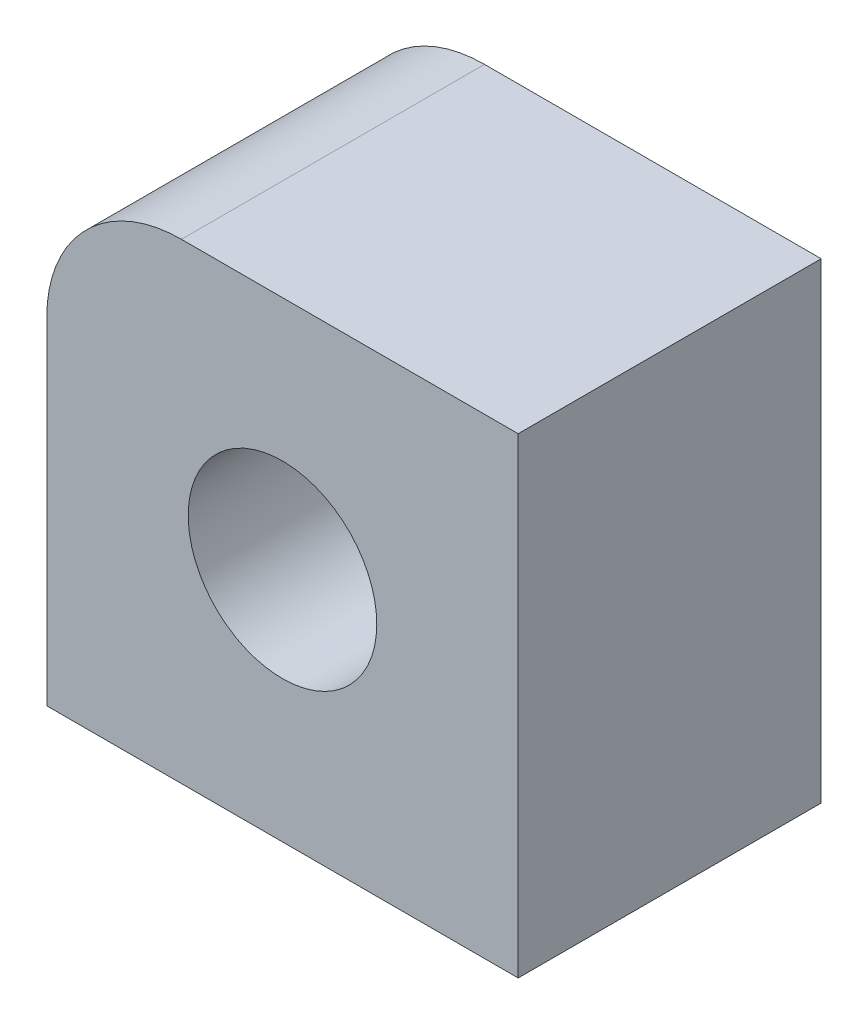
ISO-10303-21;
HEADER;
FILE_DESCRIPTION(('STEP AP214'),'2;1');
FILE_NAME('part.step','',(''),(''),'','','');
FILE_SCHEMA(('AUTOMOTIVE_DESIGN { 1 0 10303 214 1 1 1 1 }'));
ENDSEC;
DATA;
#1=APPLICATION_CONTEXT('core data for automotive mechanical design processes');
#2=APPLICATION_PROTOCOL_DEFINITION('international standard','automotive_design',2000,#1);
#3=PRODUCT_CONTEXT('',#1,'mechanical');
#4=PRODUCT('Part','Part','',(#3));
#5=PRODUCT_RELATED_PRODUCT_CATEGORY('part','',(#4));
#6=PRODUCT_DEFINITION_FORMATION('','',#4);
#7=PRODUCT_DEFINITION_CONTEXT('part definition',#1,'design');
#8=PRODUCT_DEFINITION('design','',#6,#7);
#9=PRODUCT_DEFINITION_SHAPE('','',#8);
#10=(LENGTH_UNIT() NAMED_UNIT(*) SI_UNIT(.MILLI.,.METRE.));
#11=(NAMED_UNIT(*) PLANE_ANGLE_UNIT() SI_UNIT($,.RADIAN.));
#12=(NAMED_UNIT(*) SI_UNIT($,.STERADIAN.) SOLID_ANGLE_UNIT());
#13=UNCERTAINTY_MEASURE_WITH_UNIT(LENGTH_MEASURE(1.E-05),#10,'distance_accuracy_value','');
#14=(GEOMETRIC_REPRESENTATION_CONTEXT(3) GLOBAL_UNCERTAINTY_ASSIGNED_CONTEXT((#13)) GLOBAL_UNIT_ASSIGNED_CONTEXT((#10,
#11,#12)) REPRESENTATION_CONTEXT('',''));
#15=CARTESIAN_POINT('',(0.,0.,0.));
#16=DIRECTION('',(0.,0.,1.));
#17=DIRECTION('',(1.,0.,0.));
#18=AXIS2_PLACEMENT_3D('',#15,#16,#17);
#19=CARTESIAN_POINT('',(-3.5,-3.5,4.5));
#20=DIRECTION('',(1.,0.,0.));
#21=DIRECTION('',(0.,0.,-1.));
#22=AXIS2_PLACEMENT_3D('',#19,#20,#21);
#23=PLANE('',#22);
#24=DIRECTION('',(0.,-1.,0.));
#25=VECTOR('',#24,1.);
#26=CARTESIAN_POINT('',(-3.5,-3.5,4.5));
#27=LINE('',#26,#25);
#28=CARTESIAN_POINT('',(-3.5,1.5,4.5));
#29=VERTEX_POINT('',#28);
#30=CARTESIAN_POINT('',(-3.5,-3.5,4.5));
#31=VERTEX_POINT('',#30);
#32=EDGE_CURVE('E79',#29,#31,#27,.T.);
#33=ORIENTED_EDGE('',*,*,#32,.F.);
#34=DIRECTION('',(0.,0.,-1.));
#35=VECTOR('',#34,1.);
#36=CARTESIAN_POINT('',(-3.5,1.5,4.5));
#37=LINE('',#36,#35);
#38=CARTESIAN_POINT('',(-3.5,1.5,0.));
#39=VERTEX_POINT('',#38);
#40=EDGE_CURVE('E102',#29,#39,#37,.T.);
#41=ORIENTED_EDGE('',*,*,#40,.T.);
#42=DIRECTION('',(0.,-1.,0.));
#43=VECTOR('',#42,1.);
#44=CARTESIAN_POINT('',(-3.5,-3.5,0.));
#45=LINE('',#44,#43);
#46=CARTESIAN_POINT('',(-3.5,-3.5,0.));
#47=VERTEX_POINT('',#46);
#48=EDGE_CURVE('E100',#39,#47,#45,.T.);
#49=ORIENTED_EDGE('',*,*,#48,.T.);
#50=DIRECTION('',(0.,0.,-1.));
#51=VECTOR('',#50,1.);
#52=CARTESIAN_POINT('',(-3.5,-3.5,4.5));
#53=LINE('',#52,#51);
#54=EDGE_CURVE('E94',#31,#47,#53,.T.);
#55=ORIENTED_EDGE('',*,*,#54,.F.);
#56=EDGE_LOOP('',(#33,#41,#49,#55));
#57=FACE_BOUND('',#56,.T.);
#58=ADVANCED_FACE('F33',(#57),#23,.F.);
#59=CARTESIAN_POINT('',(3.5,-3.5,4.5));
#60=DIRECTION('',(0.,1.,0.));
#61=DIRECTION('',(-1.,0.,0.));
#62=AXIS2_PLACEMENT_3D('',#59,#60,#61);
#63=PLANE('',#62);
#64=DIRECTION('',(1.,0.,0.));
#65=VECTOR('',#64,1.);
#66=CARTESIAN_POINT('',(3.5,-3.5,0.));
#67=LINE('',#66,#65);
#68=CARTESIAN_POINT('',(3.5,-3.5,0.));
#69=VERTEX_POINT('',#68);
#70=EDGE_CURVE('E115',#47,#69,#67,.T.);
#71=ORIENTED_EDGE('',*,*,#70,.T.);
#72=DIRECTION('',(0.,0.,-1.));
#73=VECTOR('',#72,1.);
#74=CARTESIAN_POINT('',(3.5,-3.5,4.5));
#75=LINE('',#74,#73);
#76=CARTESIAN_POINT('',(3.5,-3.5,4.5));
#77=VERTEX_POINT('',#76);
#78=EDGE_CURVE('E96',#77,#69,#75,.T.);
#79=ORIENTED_EDGE('',*,*,#78,.F.);
#80=DIRECTION('',(1.,0.,0.));
#81=VECTOR('',#80,1.);
#82=CARTESIAN_POINT('',(3.5,-3.5,4.5));
#83=LINE('',#82,#81);
#84=EDGE_CURVE('E82',#31,#77,#83,.T.);
#85=ORIENTED_EDGE('',*,*,#84,.F.);
#86=ORIENTED_EDGE('',*,*,#54,.T.);
#87=EDGE_LOOP('',(#71,#79,#85,#86));
#88=FACE_BOUND('',#87,.T.);
#89=ADVANCED_FACE('F93',(#88),#63,.F.);
#90=CARTESIAN_POINT('',(3.5,-3.5,4.5));
#91=DIRECTION('',(-1.,0.,0.));
#92=DIRECTION('',(0.,0.,1.));
#93=AXIS2_PLACEMENT_3D('',#90,#91,#92);
#94=PLANE('',#93);
#95=DIRECTION('',(0.,1.,0.));
#96=VECTOR('',#95,1.);
#97=CARTESIAN_POINT('',(3.5,-3.5,0.));
#98=LINE('',#97,#96);
#99=CARTESIAN_POINT('',(3.5,3.5,0.));
#100=VERTEX_POINT('',#99);
#101=EDGE_CURVE('E113',#69,#100,#98,.T.);
#102=ORIENTED_EDGE('',*,*,#101,.T.);
#103=DIRECTION('',(0.,0.,-1.));
#104=VECTOR('',#103,1.);
#105=CARTESIAN_POINT('',(3.5,3.5,4.5));
#106=LINE('',#105,#104);
#107=CARTESIAN_POINT('',(3.5,3.5,4.5));
#108=VERTEX_POINT('',#107);
#109=EDGE_CURVE('E105',#108,#100,#106,.T.);
#110=ORIENTED_EDGE('',*,*,#109,.F.);
#111=DIRECTION('',(0.,1.,0.));
#112=VECTOR('',#111,1.);
#113=CARTESIAN_POINT('',(3.5,-3.5,4.5));
#114=LINE('',#113,#112);
#115=EDGE_CURVE('E98',#77,#108,#114,.T.);
#116=ORIENTED_EDGE('',*,*,#115,.F.);
#117=ORIENTED_EDGE('',*,*,#78,.T.);
#118=EDGE_LOOP('',(#102,#110,#116,#117));
#119=FACE_BOUND('',#118,.T.);
#120=ADVANCED_FACE('F143',(#119),#94,.F.);
#121=CARTESIAN_POINT('',(3.5,3.5,4.5));
#122=DIRECTION('',(0.,-1.,0.));
#123=DIRECTION('',(1.,0.,0.));
#124=AXIS2_PLACEMENT_3D('',#121,#122,#123);
#125=PLANE('',#124);
#126=DIRECTION('',(-1.,0.,0.));
#127=VECTOR('',#126,1.);
#128=CARTESIAN_POINT('',(3.5,3.5,0.));
#129=LINE('',#128,#127);
#130=CARTESIAN_POINT('',(-1.5,3.5,0.));
#131=VERTEX_POINT('',#130);
#132=EDGE_CURVE('E89',#100,#131,#129,.T.);
#133=ORIENTED_EDGE('',*,*,#132,.T.);
#134=DIRECTION('',(0.,0.,-1.));
#135=VECTOR('',#134,1.);
#136=CARTESIAN_POINT('',(-1.5,3.5,4.5));
#137=LINE('',#136,#135);
#138=CARTESIAN_POINT('',(-1.5,3.5,4.5));
#139=VERTEX_POINT('',#138);
#140=EDGE_CURVE('E41',#131,#139,#137,.F.);
#141=ORIENTED_EDGE('',*,*,#140,.T.);
#142=DIRECTION('',(-1.,0.,0.));
#143=VECTOR('',#142,1.);
#144=CARTESIAN_POINT('',(3.5,3.5,4.5));
#145=LINE('',#144,#143);
#146=EDGE_CURVE('E111',#108,#139,#145,.T.);
#147=ORIENTED_EDGE('',*,*,#146,.F.);
#148=ORIENTED_EDGE('',*,*,#109,.T.);
#149=EDGE_LOOP('',(#133,#141,#147,#148));
#150=FACE_BOUND('',#149,.T.);
#151=ADVANCED_FACE('F136',(#150),#125,.F.);
#152=CARTESIAN_POINT('',(0.,0.,4.5));
#153=DIRECTION('',(0.,0.,1.));
#154=DIRECTION('',(1.,0.,0.));
#155=AXIS2_PLACEMENT_3D('',#152,#153,#154);
#156=PLANE('',#155);
#157=CARTESIAN_POINT('',(0.,0.,4.5));
#158=DIRECTION('',(0.,0.,1.));
#159=DIRECTION('',(1.,0.,0.));
#160=AXIS2_PLACEMENT_3D('',#157,#158,#159);
#161=CIRCLE('',#160,1.4);
#162=CARTESIAN_POINT('',(1.4,0.,4.5));
#163=VERTEX_POINT('',#162);
#164=EDGE_CURVE('E121',#163,#163,#161,.T.);
#165=ORIENTED_EDGE('',*,*,#164,.F.);
#166=EDGE_LOOP('',(#165));
#167=FACE_BOUND('',#166,.T.);
#168=ORIENTED_EDGE('',*,*,#146,.T.);
#169=CARTESIAN_POINT('',(-1.5,1.5,4.5));
#170=DIRECTION('',(0.,0.,1.));
#171=DIRECTION('',(1.,0.,0.));
#172=AXIS2_PLACEMENT_3D('',#169,#170,#171);
#173=CIRCLE('',#172,2.);
#174=EDGE_CURVE('E11',#139,#29,#173,.T.);
#175=ORIENTED_EDGE('',*,*,#174,.T.);
#176=ORIENTED_EDGE('',*,*,#32,.T.);
#177=ORIENTED_EDGE('',*,*,#84,.T.);
#178=ORIENTED_EDGE('',*,*,#115,.T.);
#179=EDGE_LOOP('',(#168,#175,#176,#177,#178));
#180=FACE_BOUND('',#179,.T.);
#181=ADVANCED_FACE('F81',(#167,#180),#156,.T.);
#182=CARTESIAN_POINT('',(0.,0.,0.));
#183=DIRECTION('',(0.,0.,1.));
#184=DIRECTION('',(1.,0.,0.));
#185=AXIS2_PLACEMENT_3D('',#182,#183,#184);
#186=PLANE('',#185);
#187=CARTESIAN_POINT('',(0.,0.,0.));
#188=DIRECTION('',(0.,0.,1.));
#189=DIRECTION('',(1.,0.,0.));
#190=AXIS2_PLACEMENT_3D('',#187,#188,#189);
#191=CIRCLE('',#190,1.4);
#192=CARTESIAN_POINT('',(1.4,0.,0.));
#193=VERTEX_POINT('',#192);
#194=EDGE_CURVE('E118',#193,#193,#191,.T.);
#195=ORIENTED_EDGE('',*,*,#194,.T.);
#196=EDGE_LOOP('',(#195));
#197=FACE_BOUND('',#196,.T.);
#198=ORIENTED_EDGE('',*,*,#48,.F.);
#199=CARTESIAN_POINT('',(-1.5,1.5,0.));
#200=DIRECTION('',(0.,0.,1.));
#201=DIRECTION('',(1.,0.,0.));
#202=AXIS2_PLACEMENT_3D('',#199,#200,#201);
#203=CIRCLE('',#202,2.);
#204=EDGE_CURVE('E55',#39,#131,#203,.F.);
#205=ORIENTED_EDGE('',*,*,#204,.T.);
#206=ORIENTED_EDGE('',*,*,#132,.F.);
#207=ORIENTED_EDGE('',*,*,#101,.F.);
#208=ORIENTED_EDGE('',*,*,#70,.F.);
#209=EDGE_LOOP('',(#198,#205,#206,#207,#208));
#210=FACE_BOUND('',#209,.T.);
#211=ADVANCED_FACE('F127',(#197,#210),#186,.F.);
#212=CARTESIAN_POINT('',(0.,0.,0.));
#213=DIRECTION('',(0.,0.,1.));
#214=DIRECTION('',(1.,0.,0.));
#215=AXIS2_PLACEMENT_3D('',#212,#213,#214);
#216=CYLINDRICAL_SURFACE('',#215,1.4);
#217=ORIENTED_EDGE('',*,*,#194,.F.);
#218=EDGE_LOOP('',(#217));
#219=FACE_BOUND('',#218,.T.);
#220=ORIENTED_EDGE('',*,*,#164,.T.);
#221=EDGE_LOOP('',(#220));
#222=FACE_BOUND('',#221,.T.);
#223=ADVANCED_FACE('F129',(#219,#222),#216,.F.);
#224=CARTESIAN_POINT('',(-1.5,1.5,4.5));
#225=DIRECTION('',(0.,0.,-1.));
#226=DIRECTION('',(-1.,0.,0.));
#227=AXIS2_PLACEMENT_3D('',#224,#225,#226);
#228=CYLINDRICAL_SURFACE('',#227,2.);
#229=ORIENTED_EDGE('',*,*,#174,.F.);
#230=ORIENTED_EDGE('',*,*,#140,.F.);
#231=ORIENTED_EDGE('',*,*,#204,.F.);
#232=ORIENTED_EDGE('',*,*,#40,.F.);
#233=EDGE_LOOP('',(#229,#230,#231,#232));
#234=FACE_BOUND('',#233,.T.);
#235=ADVANCED_FACE('F35',(#234),#228,.T.);
#236=CLOSED_SHELL('',(#58,#89,#120,#151,#181,#211,#223,#235));
#237=MANIFOLD_SOLID_BREP('B2',#236);
#238=ADVANCED_BREP_SHAPE_REPRESENTATION('',(#18,#237),#14);
#239=SHAPE_DEFINITION_REPRESENTATION(#9,#238);
ENDSEC;
END-ISO-10303-21;
